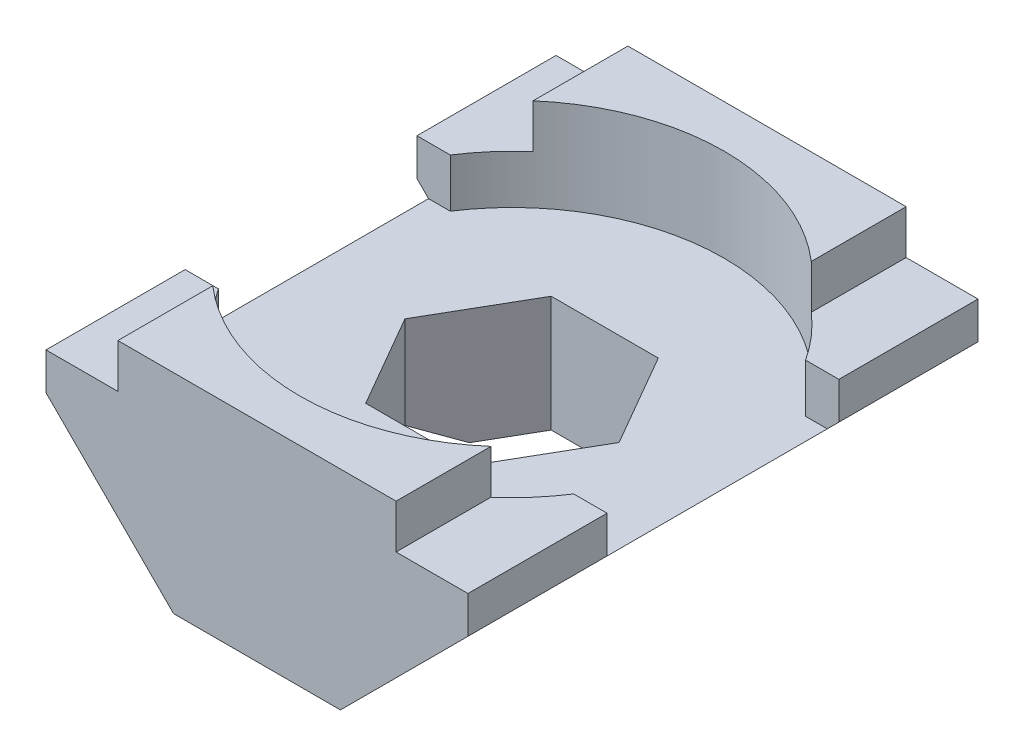
ISO-10303-21;
HEADER;
FILE_DESCRIPTION(('STEP AP214'),'2;1');
FILE_NAME('part.step','',(''),(''),'','','');
FILE_SCHEMA(('AUTOMOTIVE_DESIGN { 1 0 10303 214 1 1 1 1 }'));
ENDSEC;
DATA;
#1=APPLICATION_CONTEXT('core data for automotive mechanical design processes');
#2=APPLICATION_PROTOCOL_DEFINITION('international standard','automotive_design',2000,#1);
#3=PRODUCT_CONTEXT('',#1,'mechanical');
#4=PRODUCT('Part','Part','',(#3));
#5=PRODUCT_RELATED_PRODUCT_CATEGORY('part','',(#4));
#6=PRODUCT_DEFINITION_FORMATION('','',#4);
#7=PRODUCT_DEFINITION_CONTEXT('part definition',#1,'design');
#8=PRODUCT_DEFINITION('design','',#6,#7);
#9=PRODUCT_DEFINITION_SHAPE('','',#8);
#10=(LENGTH_UNIT() NAMED_UNIT(*) SI_UNIT(.MILLI.,.METRE.));
#11=(NAMED_UNIT(*) PLANE_ANGLE_UNIT() SI_UNIT($,.RADIAN.));
#12=(NAMED_UNIT(*) SI_UNIT($,.STERADIAN.) SOLID_ANGLE_UNIT());
#13=UNCERTAINTY_MEASURE_WITH_UNIT(LENGTH_MEASURE(1.E-05),#10,'distance_accuracy_value','');
#14=(GEOMETRIC_REPRESENTATION_CONTEXT(3) GLOBAL_UNCERTAINTY_ASSIGNED_CONTEXT((#13)) GLOBAL_UNIT_ASSIGNED_CONTEXT((#10,
#11,#12)) REPRESENTATION_CONTEXT('',''));
#15=CARTESIAN_POINT('',(0.,0.,0.));
#16=DIRECTION('',(0.,0.,1.));
#17=DIRECTION('',(1.,0.,0.));
#18=AXIS2_PLACEMENT_3D('',#15,#16,#17);
#19=CARTESIAN_POINT('',(-1.55,0.,16.));
#20=DIRECTION('',(0.,-1.,0.));
#21=DIRECTION('',(1.,0.,0.));
#22=AXIS2_PLACEMENT_3D('',#19,#20,#21);
#23=PLANE('',#22);
#24=DIRECTION('',(0.,0.,-1.));
#25=VECTOR('',#24,1.);
#26=CARTESIAN_POINT('',(-1.55,0.,16.));
#27=LINE('',#26,#25);
#28=CARTESIAN_POINT('',(-1.55,0.,13.5));
#29=VERTEX_POINT('',#28);
#30=CARTESIAN_POINT('',(-1.55,0.,10.5));
#31=VERTEX_POINT('',#30);
#32=EDGE_CURVE('E306',#29,#31,#27,.T.);
#33=ORIENTED_EDGE('',*,*,#32,.F.);
#34=DIRECTION('',(1.,0.,0.));
#35=VECTOR('',#34,1.);
#36=CARTESIAN_POINT('',(-1.55,0.,13.5));
#37=LINE('',#36,#35);
#38=CARTESIAN_POINT('',(0.,0.,13.5));
#39=VERTEX_POINT('',#38);
#40=EDGE_CURVE('E602',#29,#39,#37,.T.);
#41=ORIENTED_EDGE('',*,*,#40,.T.);
#42=DIRECTION('',(0.,0.,-1.));
#43=VECTOR('',#42,1.);
#44=CARTESIAN_POINT('',(0.,0.,16.));
#45=LINE('',#44,#43);
#46=CARTESIAN_POINT('',(0.,0.,11.4540736819008));
#47=VERTEX_POINT('',#46);
#48=EDGE_CURVE('E385',#39,#47,#45,.T.);
#49=ORIENTED_EDGE('',*,*,#48,.T.);
#50=CARTESIAN_POINT('',(3.,0.,8.));
#51=DIRECTION('',(0.,-1.,0.));
#52=DIRECTION('',(1.,0.,0.));
#53=AXIS2_PLACEMENT_3D('',#50,#51,#52);
#54=CIRCLE('',#53,4.575);
#55=CARTESIAN_POINT('',(-0.831530373101587,0.,10.5));
#56=VERTEX_POINT('',#55);
#57=EDGE_CURVE('E358',#47,#56,#54,.T.);
#58=ORIENTED_EDGE('',*,*,#57,.T.);
#59=DIRECTION('',(1.,0.,0.));
#60=VECTOR('',#59,1.);
#61=CARTESIAN_POINT('',(-1.55,0.,10.5));
#62=LINE('',#61,#60);
#63=EDGE_CURVE('E341',#31,#56,#62,.T.);
#64=ORIENTED_EDGE('',*,*,#63,.F.);
#65=EDGE_LOOP('',(#33,#41,#49,#58,#64));
#66=FACE_BOUND('',#65,.T.);
#67=ADVANCED_FACE('F39',(#66),#23,.F.);
#68=CARTESIAN_POINT('',(-1.55,-0.8,16.));
#69=DIRECTION('',(1.,0.,0.));
#70=DIRECTION('',(0.,0.,-1.));
#71=AXIS2_PLACEMENT_3D('',#68,#69,#70);
#72=PLANE('',#71);
#73=CARTESIAN_POINT('',(-1.55,0.,5.5));
#74=VERTEX_POINT('',#73);
#75=CARTESIAN_POINT('',(-1.55,0.,2.5));
#76=VERTEX_POINT('',#75);
#77=EDGE_CURVE('E305',#74,#76,#27,.T.);
#78=ORIENTED_EDGE('',*,*,#77,.T.);
#79=DIRECTION('',(0.,1.,0.));
#80=VECTOR('',#79,1.);
#81=CARTESIAN_POINT('',(-1.55,-3.55,2.5));
#82=LINE('',#81,#80);
#83=CARTESIAN_POINT('',(-1.55,-0.8,2.5));
#84=VERTEX_POINT('',#83);
#85=EDGE_CURVE('E603',#84,#76,#82,.T.);
#86=ORIENTED_EDGE('',*,*,#85,.F.);
#87=DIRECTION('',(0.,0.,-1.));
#88=VECTOR('',#87,1.);
#89=CARTESIAN_POINT('',(-1.55,-0.8,16.));
#90=LINE('',#89,#88);
#91=CARTESIAN_POINT('',(-1.55,-0.8,5.5));
#92=VERTEX_POINT('',#91);
#93=EDGE_CURVE('E301',#92,#84,#90,.T.);
#94=ORIENTED_EDGE('',*,*,#93,.F.);
#95=DIRECTION('',(0.,-1.,0.));
#96=VECTOR('',#95,1.);
#97=CARTESIAN_POINT('',(-1.55,0.95,5.5));
#98=LINE('',#97,#96);
#99=EDGE_CURVE('E428',#74,#92,#98,.T.);
#100=ORIENTED_EDGE('',*,*,#99,.F.);
#101=EDGE_LOOP('',(#78,#86,#94,#100));
#102=FACE_BOUND('',#101,.T.);
#103=ADVANCED_FACE('F684',(#102),#72,.F.);
#104=CARTESIAN_POINT('',(7.55,0.,16.));
#105=DIRECTION('',(-1.,0.,0.));
#106=DIRECTION('',(0.,0.,1.));
#107=AXIS2_PLACEMENT_3D('',#104,#105,#106);
#108=PLANE('',#107);
#109=DIRECTION('',(0.,0.,-1.));
#110=VECTOR('',#109,1.);
#111=CARTESIAN_POINT('',(7.55,0.,16.));
#112=LINE('',#111,#110);
#113=CARTESIAN_POINT('',(7.55,0.,13.5));
#114=VERTEX_POINT('',#113);
#115=CARTESIAN_POINT('',(7.55,0.,10.5));
#116=VERTEX_POINT('',#115);
#117=EDGE_CURVE('E286',#114,#116,#112,.T.);
#118=ORIENTED_EDGE('',*,*,#117,.F.);
#119=DIRECTION('',(0.,1.,0.));
#120=VECTOR('',#119,1.);
#121=CARTESIAN_POINT('',(7.55,-3.55,13.5));
#122=LINE('',#121,#120);
#123=CARTESIAN_POINT('',(7.55,-0.799999999999999,13.5));
#124=VERTEX_POINT('',#123);
#125=EDGE_CURVE('E615',#124,#114,#122,.T.);
#126=ORIENTED_EDGE('',*,*,#125,.F.);
#127=DIRECTION('',(0.,0.,-1.));
#128=VECTOR('',#127,1.);
#129=CARTESIAN_POINT('',(7.55,-0.799999999999999,16.));
#130=LINE('',#129,#128);
#131=CARTESIAN_POINT('',(7.55,-0.799999999999999,10.5));
#132=VERTEX_POINT('',#131);
#133=EDGE_CURVE('E290',#124,#132,#130,.T.);
#134=ORIENTED_EDGE('',*,*,#133,.T.);
#135=DIRECTION('',(0.,-1.,0.));
#136=VECTOR('',#135,1.);
#137=CARTESIAN_POINT('',(7.55,0.95,10.5));
#138=LINE('',#137,#136);
#139=EDGE_CURVE('E435',#116,#132,#138,.T.);
#140=ORIENTED_EDGE('',*,*,#139,.F.);
#141=EDGE_LOOP('',(#118,#126,#134,#140));
#142=FACE_BOUND('',#141,.T.);
#143=ADVANCED_FACE('F665',(#142),#108,.F.);
#144=CARTESIAN_POINT('',(6.,0.,16.));
#145=DIRECTION('',(0.,-1.,0.));
#146=DIRECTION('',(1.,0.,0.));
#147=AXIS2_PLACEMENT_3D('',#144,#145,#146);
#148=PLANE('',#147);
#149=DIRECTION('',(0.,0.,-1.));
#150=VECTOR('',#149,1.);
#151=CARTESIAN_POINT('',(6.,0.,16.));
#152=LINE('',#151,#150);
#153=CARTESIAN_POINT('',(6.,0.,13.5));
#154=VERTEX_POINT('',#153);
#155=CARTESIAN_POINT('',(6.,0.,11.4540736819008));
#156=VERTEX_POINT('',#155);
#157=EDGE_CURVE('E282',#154,#156,#152,.T.);
#158=ORIENTED_EDGE('',*,*,#157,.F.);
#159=DIRECTION('',(1.,0.,0.));
#160=VECTOR('',#159,1.);
#161=CARTESIAN_POINT('',(6.,0.,13.5));
#162=LINE('',#161,#160);
#163=EDGE_CURVE('E626',#154,#114,#162,.T.);
#164=ORIENTED_EDGE('',*,*,#163,.T.);
#165=ORIENTED_EDGE('',*,*,#117,.T.);
#166=DIRECTION('',(1.,0.,0.));
#167=VECTOR('',#166,1.);
#168=CARTESIAN_POINT('',(6.,0.,10.5));
#169=LINE('',#168,#167);
#170=CARTESIAN_POINT('',(6.83153037310159,0.,10.5));
#171=VERTEX_POINT('',#170);
#172=EDGE_CURVE('E456',#171,#116,#169,.T.);
#173=ORIENTED_EDGE('',*,*,#172,.F.);
#174=CARTESIAN_POINT('',(3.,0.,8.));
#175=DIRECTION('',(0.,-1.,0.));
#176=DIRECTION('',(1.,0.,0.));
#177=AXIS2_PLACEMENT_3D('',#174,#175,#176);
#178=CIRCLE('',#177,4.575);
#179=EDGE_CURVE('E378',#171,#156,#178,.T.);
#180=ORIENTED_EDGE('',*,*,#179,.T.);
#181=EDGE_LOOP('',(#158,#164,#165,#173,#180));
#182=FACE_BOUND('',#181,.T.);
#183=ADVANCED_FACE('F656',(#182),#148,.F.);
#184=CARTESIAN_POINT('',(0.,0.,4.54592631809916));
#185=VERTEX_POINT('',#184);
#186=CARTESIAN_POINT('',(0.,0.,2.5));
#187=VERTEX_POINT('',#186);
#188=EDGE_CURVE('E384',#185,#187,#45,.T.);
#189=ORIENTED_EDGE('',*,*,#188,.T.);
#190=DIRECTION('',(-1.,0.,0.));
#191=VECTOR('',#190,1.);
#192=CARTESIAN_POINT('',(-1.55,0.,2.5));
#193=LINE('',#192,#191);
#194=EDGE_CURVE('E398',#187,#76,#193,.T.);
#195=ORIENTED_EDGE('',*,*,#194,.T.);
#196=ORIENTED_EDGE('',*,*,#77,.F.);
#197=DIRECTION('',(-1.,0.,0.));
#198=VECTOR('',#197,1.);
#199=CARTESIAN_POINT('',(-1.55,0.,5.5));
#200=LINE('',#199,#198);
#201=CARTESIAN_POINT('',(-0.83153037310159,0.,5.5));
#202=VERTEX_POINT('',#201);
#203=EDGE_CURVE('E443',#202,#74,#200,.T.);
#204=ORIENTED_EDGE('',*,*,#203,.F.);
#205=EDGE_CURVE('E369',#202,#185,#54,.T.);
#206=ORIENTED_EDGE('',*,*,#205,.T.);
#207=EDGE_LOOP('',(#189,#195,#196,#204,#206));
#208=FACE_BOUND('',#207,.T.);
#209=ADVANCED_FACE('F396',(#208),#23,.F.);
#210=CARTESIAN_POINT('',(-1.55,-0.8,13.5));
#211=VERTEX_POINT('',#210);
#212=CARTESIAN_POINT('',(-1.55,-0.8,10.5));
#213=VERTEX_POINT('',#212);
#214=EDGE_CURVE('E302',#211,#213,#90,.T.);
#215=ORIENTED_EDGE('',*,*,#214,.F.);
#216=DIRECTION('',(0.,1.,0.));
#217=VECTOR('',#216,1.);
#218=CARTESIAN_POINT('',(-1.55,-3.55,13.5));
#219=LINE('',#218,#217);
#220=EDGE_CURVE('E255',#211,#29,#219,.T.);
#221=ORIENTED_EDGE('',*,*,#220,.T.);
#222=ORIENTED_EDGE('',*,*,#32,.T.);
#223=DIRECTION('',(0.,-1.,0.));
#224=VECTOR('',#223,1.);
#225=CARTESIAN_POINT('',(-1.55,0.95,10.5));
#226=LINE('',#225,#224);
#227=EDGE_CURVE('E439',#31,#213,#226,.T.);
#228=ORIENTED_EDGE('',*,*,#227,.T.);
#229=EDGE_LOOP('',(#215,#221,#222,#228));
#230=FACE_BOUND('',#229,.T.);
#231=ADVANCED_FACE('F639',(#230),#72,.F.);
#232=CARTESIAN_POINT('',(1.20000000000001,-3.55,16.));
#233=DIRECTION('',(0.707106781186546,0.707106781186549,0.));
#234=DIRECTION('',(-0.707106781186549,0.707106781186546,0.));
#235=AXIS2_PLACEMENT_3D('',#232,#233,#234);
#236=PLANE('',#235);
#237=ORIENTED_EDGE('',*,*,#93,.T.);
#238=DIRECTION('',(0.707106781186549,-0.707106781186546,0.));
#239=VECTOR('',#238,1.);
#240=CARTESIAN_POINT('',(1.20000000000001,-3.55,2.5));
#241=LINE('',#240,#239);
#242=CARTESIAN_POINT('',(1.20000000000001,-3.55,2.5));
#243=VERTEX_POINT('',#242);
#244=EDGE_CURVE('E416',#84,#243,#241,.T.);
#245=ORIENTED_EDGE('',*,*,#244,.T.);
#246=DIRECTION('',(0.,0.,-1.));
#247=VECTOR('',#246,1.);
#248=CARTESIAN_POINT('',(1.20000000000001,-3.55,16.));
#249=LINE('',#248,#247);
#250=CARTESIAN_POINT('',(1.20000000000001,-3.55,7.11769145362396));
#251=VERTEX_POINT('',#250);
#252=EDGE_CURVE('E297',#251,#243,#249,.T.);
#253=ORIENTED_EDGE('',*,*,#252,.F.);
#254=DIRECTION('',(-0.447213595499958,0.447213595499956,0.774596669241484));
#255=VECTOR('',#254,1.);
#256=CARTESIAN_POINT('',(-1.87692193816531,-0.473078061834696,12.4470765814496));
#257=LINE('',#256,#255);
#258=CARTESIAN_POINT('',(0.690598923241496,-3.04059892324149,8.));
#259=VERTEX_POINT('',#258);
#260=EDGE_CURVE('E539',#251,#259,#257,.T.);
#261=ORIENTED_EDGE('',*,*,#260,.T.);
#262=DIRECTION('',(0.447213595499959,-0.447213595499957,0.774596669241484));
#263=VECTOR('',#262,1.);
#264=CARTESIAN_POINT('',(3.66564064605511,-6.01564064605509,13.1529234185504));
#265=LINE('',#264,#263);
#266=CARTESIAN_POINT('',(1.20000000000001,-3.55,8.88230854637604));
#267=VERTEX_POINT('',#266);
#268=EDGE_CURVE('E542',#259,#267,#265,.T.);
#269=ORIENTED_EDGE('',*,*,#268,.T.);
#270=CARTESIAN_POINT('',(1.20000000000001,-3.55,13.5));
#271=VERTEX_POINT('',#270);
#272=EDGE_CURVE('E298',#271,#267,#249,.T.);
#273=ORIENTED_EDGE('',*,*,#272,.F.);
#274=DIRECTION('',(-0.707106781186549,0.707106781186546,0.));
#275=VECTOR('',#274,1.);
#276=CARTESIAN_POINT('',(1.20000000000001,-3.55,13.5));
#277=LINE('',#276,#275);
#278=EDGE_CURVE('E267',#271,#211,#277,.T.);
#279=ORIENTED_EDGE('',*,*,#278,.T.);
#280=ORIENTED_EDGE('',*,*,#214,.T.);
#281=DIRECTION('',(-0.707106781186549,0.707106781186546,0.));
#282=VECTOR('',#281,1.);
#283=CARTESIAN_POINT('',(1.20000000000001,-3.55,10.5));
#284=LINE('',#283,#282);
#285=CARTESIAN_POINT('',(-1.3,-1.05,10.5));
#286=VERTEX_POINT('',#285);
#287=EDGE_CURVE('E466',#286,#213,#284,.T.);
#288=ORIENTED_EDGE('',*,*,#287,.F.);
#289=DIRECTION('',(0.,0.,1.));
#290=VECTOR('',#289,1.);
#291=CARTESIAN_POINT('',(-1.3,-1.05,16.));
#292=LINE('',#291,#290);
#293=CARTESIAN_POINT('',(-1.3,-1.05,5.5));
#294=VERTEX_POINT('',#293);
#295=EDGE_CURVE('E382',#294,#286,#292,.T.);
#296=ORIENTED_EDGE('',*,*,#295,.F.);
#297=DIRECTION('',(0.707106781186549,-0.707106781186546,0.));
#298=VECTOR('',#297,1.);
#299=CARTESIAN_POINT('',(1.20000000000001,-3.55,5.5));
#300=LINE('',#299,#298);
#301=EDGE_CURVE('E452',#92,#294,#300,.T.);
#302=ORIENTED_EDGE('',*,*,#301,.F.);
#303=EDGE_LOOP('',(#237,#245,#253,#261,#269,#273,#279,#280,#288,#296,#302));
#304=FACE_BOUND('',#303,.T.);
#305=ADVANCED_FACE('F637',(#304),#236,.F.);
#306=CARTESIAN_POINT('',(7.55,-0.799999999999999,16.));
#307=DIRECTION('',(-0.707106781186546,0.707106781186549,0.));
#308=DIRECTION('',(-0.707106781186549,-0.707106781186546,0.));
#309=AXIS2_PLACEMENT_3D('',#306,#307,#308);
#310=PLANE('',#309);
#311=DIRECTION('',(0.,0.,-1.));
#312=VECTOR('',#311,1.);
#313=CARTESIAN_POINT('',(4.79999999999999,-3.55,16.));
#314=LINE('',#313,#312);
#315=CARTESIAN_POINT('',(4.79999999999999,-3.55,7.11769145362396));
#316=VERTEX_POINT('',#315);
#317=CARTESIAN_POINT('',(4.79999999999999,-3.55,2.5));
#318=VERTEX_POINT('',#317);
#319=EDGE_CURVE('E293',#316,#318,#314,.T.);
#320=ORIENTED_EDGE('',*,*,#319,.T.);
#321=DIRECTION('',(0.707106781186549,0.707106781186546,0.));
#322=VECTOR('',#321,1.);
#323=CARTESIAN_POINT('',(7.55,-0.799999999999999,2.5));
#324=LINE('',#323,#322);
#325=CARTESIAN_POINT('',(7.55,-0.799999999999999,2.5));
#326=VERTEX_POINT('',#325);
#327=EDGE_CURVE('E409',#318,#326,#324,.T.);
#328=ORIENTED_EDGE('',*,*,#327,.T.);
#329=CARTESIAN_POINT('',(7.55,-0.799999999999999,5.5));
#330=VERTEX_POINT('',#329);
#331=EDGE_CURVE('E289',#330,#326,#130,.T.);
#332=ORIENTED_EDGE('',*,*,#331,.F.);
#333=DIRECTION('',(0.707106781186549,0.707106781186546,0.));
#334=VECTOR('',#333,1.);
#335=CARTESIAN_POINT('',(7.55,-0.799999999999999,5.5));
#336=LINE('',#335,#334);
#337=CARTESIAN_POINT('',(7.3,-1.05,5.5));
#338=VERTEX_POINT('',#337);
#339=EDGE_CURVE('E449',#338,#330,#336,.T.);
#340=ORIENTED_EDGE('',*,*,#339,.F.);
#341=DIRECTION('',(0.,0.,-1.));
#342=VECTOR('',#341,1.);
#343=CARTESIAN_POINT('',(7.3,-1.05,16.));
#344=LINE('',#343,#342);
#345=CARTESIAN_POINT('',(7.3,-1.05,10.5));
#346=VERTEX_POINT('',#345);
#347=EDGE_CURVE('E317',#346,#338,#344,.T.);
#348=ORIENTED_EDGE('',*,*,#347,.F.);
#349=DIRECTION('',(-0.707106781186549,-0.707106781186546,0.));
#350=VECTOR('',#349,1.);
#351=CARTESIAN_POINT('',(7.55,-0.799999999999999,10.5));
#352=LINE('',#351,#350);
#353=EDGE_CURVE('E462',#132,#346,#352,.T.);
#354=ORIENTED_EDGE('',*,*,#353,.F.);
#355=ORIENTED_EDGE('',*,*,#133,.F.);
#356=DIRECTION('',(-0.707106781186549,-0.707106781186546,0.));
#357=VECTOR('',#356,1.);
#358=CARTESIAN_POINT('',(7.55,-0.799999999999999,13.5));
#359=LINE('',#358,#357);
#360=CARTESIAN_POINT('',(4.79999999999999,-3.55,13.5));
#361=VERTEX_POINT('',#360);
#362=EDGE_CURVE('E630',#124,#361,#359,.T.);
#363=ORIENTED_EDGE('',*,*,#362,.T.);
#364=CARTESIAN_POINT('',(4.79999999999999,-3.55,8.88230854637604));
#365=VERTEX_POINT('',#364);
#366=EDGE_CURVE('E294',#361,#365,#314,.T.);
#367=ORIENTED_EDGE('',*,*,#366,.T.);
#368=DIRECTION('',(0.447213595499958,0.447213595499957,-0.774596669241484));
#369=VECTOR('',#368,1.);
#370=CARTESIAN_POINT('',(3.43435935394489,-4.91564064605509,11.2476675302247));
#371=LINE('',#370,#369);
#372=CARTESIAN_POINT('',(5.3094010767585,-3.04059892324149,8.));
#373=VERTEX_POINT('',#372);
#374=EDGE_CURVE('E362',#365,#373,#371,.T.);
#375=ORIENTED_EDGE('',*,*,#374,.T.);
#376=DIRECTION('',(-0.447213595499958,-0.447213595499957,-0.774596669241484));
#377=VECTOR('',#376,1.);
#378=CARTESIAN_POINT('',(8.97692193816531,0.626921938165306,14.3523324697754));
#379=LINE('',#378,#377);
#380=EDGE_CURVE('E520',#373,#316,#379,.T.);
#381=ORIENTED_EDGE('',*,*,#380,.T.);
#382=EDGE_LOOP('',(#320,#328,#332,#340,#348,#354,#355,#363,#367,#375,#381));
#383=FACE_BOUND('',#382,.T.);
#384=ADVANCED_FACE('F552',(#383),#310,.F.);
#385=ORIENTED_EDGE('',*,*,#331,.T.);
#386=DIRECTION('',(0.,1.,0.));
#387=VECTOR('',#386,1.);
#388=CARTESIAN_POINT('',(7.55,-3.55,2.5));
#389=LINE('',#388,#387);
#390=CARTESIAN_POINT('',(7.55,0.,2.5));
#391=VERTEX_POINT('',#390);
#392=EDGE_CURVE('E600',#326,#391,#389,.T.);
#393=ORIENTED_EDGE('',*,*,#392,.T.);
#394=CARTESIAN_POINT('',(7.55,0.,5.5));
#395=VERTEX_POINT('',#394);
#396=EDGE_CURVE('E285',#395,#391,#112,.T.);
#397=ORIENTED_EDGE('',*,*,#396,.F.);
#398=DIRECTION('',(0.,-1.,0.));
#399=VECTOR('',#398,1.);
#400=CARTESIAN_POINT('',(7.55,0.95,5.5));
#401=LINE('',#400,#399);
#402=EDGE_CURVE('E431',#395,#330,#401,.T.);
#403=ORIENTED_EDGE('',*,*,#402,.T.);
#404=EDGE_LOOP('',(#385,#393,#397,#403));
#405=FACE_BOUND('',#404,.T.);
#406=ADVANCED_FACE('F598',(#405),#108,.F.);
#407=ORIENTED_EDGE('',*,*,#396,.T.);
#408=DIRECTION('',(-1.,0.,0.));
#409=VECTOR('',#408,1.);
#410=CARTESIAN_POINT('',(6.,0.,2.5));
#411=LINE('',#410,#409);
#412=CARTESIAN_POINT('',(6.,0.,2.5));
#413=VERTEX_POINT('',#412);
#414=EDGE_CURVE('E266',#391,#413,#411,.T.);
#415=ORIENTED_EDGE('',*,*,#414,.T.);
#416=CARTESIAN_POINT('',(6.,0.,4.54592631809916));
#417=VERTEX_POINT('',#416);
#418=EDGE_CURVE('E264',#417,#413,#152,.T.);
#419=ORIENTED_EDGE('',*,*,#418,.F.);
#420=CARTESIAN_POINT('',(6.83153037310159,0.,5.5));
#421=VERTEX_POINT('',#420);
#422=EDGE_CURVE('E373',#417,#421,#178,.T.);
#423=ORIENTED_EDGE('',*,*,#422,.T.);
#424=DIRECTION('',(-1.,0.,0.));
#425=VECTOR('',#424,1.);
#426=CARTESIAN_POINT('',(6.,0.,5.5));
#427=LINE('',#426,#425);
#428=EDGE_CURVE('E446',#395,#421,#427,.T.);
#429=ORIENTED_EDGE('',*,*,#428,.F.);
#430=EDGE_LOOP('',(#407,#415,#419,#423,#429));
#431=FACE_BOUND('',#430,.T.);
#432=ADVANCED_FACE('F595',(#431),#148,.F.);
#433=CARTESIAN_POINT('',(3.,-1.05,8.));
#434=DIRECTION('',(0.,1.,0.));
#435=DIRECTION('',(0.,0.,1.));
#436=AXIS2_PLACEMENT_3D('',#433,#434,#435);
#437=CYLINDRICAL_SURFACE('',#436,4.575);
#438=DIRECTION('',(0.,1.,0.));
#439=VECTOR('',#438,1.);
#440=CARTESIAN_POINT('',(-0.831530373101587,-1.05,10.5));
#441=LINE('',#440,#439);
#442=CARTESIAN_POINT('',(-0.831530373101587,-1.05,10.5));
#443=VERTEX_POINT('',#442);
#444=EDGE_CURVE('E47',#56,#443,#441,.F.);
#445=ORIENTED_EDGE('',*,*,#444,.F.);
#446=ORIENTED_EDGE('',*,*,#57,.F.);
#447=DIRECTION('',(0.,1.,0.));
#448=VECTOR('',#447,1.);
#449=CARTESIAN_POINT('',(0.,-1.05,11.4540736819008));
#450=LINE('',#449,#448);
#451=CARTESIAN_POINT('',(0.,0.95,11.4540736819008));
#452=VERTEX_POINT('',#451);
#453=EDGE_CURVE('E309',#452,#47,#450,.F.);
#454=ORIENTED_EDGE('',*,*,#453,.F.);
#455=CARTESIAN_POINT('',(3.,0.95,8.));
#456=DIRECTION('',(0.,1.,0.));
#457=DIRECTION('',(0.,0.,1.));
#458=AXIS2_PLACEMENT_3D('',#455,#456,#457);
#459=CIRCLE('',#458,4.575);
#460=CARTESIAN_POINT('',(6.,0.95,11.4540736819008));
#461=VERTEX_POINT('',#460);
#462=EDGE_CURVE('E359',#452,#461,#459,.T.);
#463=ORIENTED_EDGE('',*,*,#462,.T.);
#464=DIRECTION('',(0.,1.,0.));
#465=VECTOR('',#464,1.);
#466=CARTESIAN_POINT('',(6.,-1.05,11.4540736819008));
#467=LINE('',#466,#465);
#468=EDGE_CURVE('E377',#156,#461,#467,.T.);
#469=ORIENTED_EDGE('',*,*,#468,.F.);
#470=ORIENTED_EDGE('',*,*,#179,.F.);
#471=DIRECTION('',(0.,1.,0.));
#472=VECTOR('',#471,1.);
#473=CARTESIAN_POINT('',(6.83153037310159,-1.05,10.5));
#474=LINE('',#473,#472);
#475=CARTESIAN_POINT('',(6.83153037310159,-1.05,10.5));
#476=VERTEX_POINT('',#475);
#477=EDGE_CURVE('E327',#476,#171,#474,.T.);
#478=ORIENTED_EDGE('',*,*,#477,.F.);
#479=CARTESIAN_POINT('',(3.,-1.05,8.));
#480=DIRECTION('',(0.,1.,0.));
#481=DIRECTION('',(0.,0.,1.));
#482=AXIS2_PLACEMENT_3D('',#479,#480,#481);
#483=CIRCLE('',#482,4.575);
#484=EDGE_CURVE('E347',#443,#476,#483,.T.);
#485=ORIENTED_EDGE('',*,*,#484,.F.);
#486=EDGE_LOOP('',(#445,#446,#454,#463,#469,#470,#478,#485));
#487=FACE_BOUND('',#486,.T.);
#488=ADVANCED_FACE('F348',(#487),#437,.F.);
#489=DIRECTION('',(0.,1.,0.));
#490=VECTOR('',#489,1.);
#491=CARTESIAN_POINT('',(6.83153037310159,-1.05,5.5));
#492=LINE('',#491,#490);
#493=CARTESIAN_POINT('',(6.83153037310159,-1.05,5.5));
#494=VERTEX_POINT('',#493);
#495=EDGE_CURVE('E323',#421,#494,#492,.F.);
#496=ORIENTED_EDGE('',*,*,#495,.F.);
#497=ORIENTED_EDGE('',*,*,#422,.F.);
#498=DIRECTION('',(0.,1.,0.));
#499=VECTOR('',#498,1.);
#500=CARTESIAN_POINT('',(6.,-1.05,4.54592631809916));
#501=LINE('',#500,#499);
#502=CARTESIAN_POINT('',(6.,0.95,4.54592631809916));
#503=VERTEX_POINT('',#502);
#504=EDGE_CURVE('E370',#503,#417,#501,.F.);
#505=ORIENTED_EDGE('',*,*,#504,.F.);
#506=CARTESIAN_POINT('',(0.,0.95,4.54592631809916));
#507=VERTEX_POINT('',#506);
#508=EDGE_CURVE('E271',#503,#507,#459,.T.);
#509=ORIENTED_EDGE('',*,*,#508,.T.);
#510=DIRECTION('',(0.,1.,0.));
#511=VECTOR('',#510,1.);
#512=CARTESIAN_POINT('',(0.,-1.05,4.54592631809916));
#513=LINE('',#512,#511);
#514=EDGE_CURVE('E313',#185,#507,#513,.T.);
#515=ORIENTED_EDGE('',*,*,#514,.F.);
#516=ORIENTED_EDGE('',*,*,#205,.F.);
#517=DIRECTION('',(0.,1.,0.));
#518=VECTOR('',#517,1.);
#519=CARTESIAN_POINT('',(-0.83153037310159,-1.05,5.5));
#520=LINE('',#519,#518);
#521=CARTESIAN_POINT('',(-0.83153037310159,-1.05,5.5));
#522=VERTEX_POINT('',#521);
#523=EDGE_CURVE('E320',#522,#202,#520,.T.);
#524=ORIENTED_EDGE('',*,*,#523,.F.);
#525=EDGE_CURVE('E353',#494,#522,#483,.T.);
#526=ORIENTED_EDGE('',*,*,#525,.F.);
#527=EDGE_LOOP('',(#496,#497,#505,#509,#515,#516,#524,#526));
#528=FACE_BOUND('',#527,.T.);
#529=ADVANCED_FACE('F688',(#528),#437,.F.);
#530=CARTESIAN_POINT('',(4.79999999999999,-3.55,16.));
#531=DIRECTION('',(0.,1.,0.));
#532=DIRECTION('',(0.,0.,1.));
#533=AXIS2_PLACEMENT_3D('',#530,#531,#532);
#534=PLANE('',#533);
#535=ORIENTED_EDGE('',*,*,#366,.F.);
#536=DIRECTION('',(-1.,0.,0.));
#537=VECTOR('',#536,1.);
#538=CARTESIAN_POINT('',(-1.55,-3.55,13.5));
#539=LINE('',#538,#537);
#540=EDGE_CURVE('E612',#361,#271,#539,.T.);
#541=ORIENTED_EDGE('',*,*,#540,.T.);
#542=ORIENTED_EDGE('',*,*,#272,.T.);
#543=DIRECTION('',(0.5,0.,0.866025403784439));
#544=VECTOR('',#543,1.);
#545=CARTESIAN_POINT('',(0.690598923241497,-3.55,8.));
#546=LINE('',#545,#544);
#547=CARTESIAN_POINT('',(1.84529946162075,-3.55,10.));
#548=VERTEX_POINT('',#547);
#549=EDGE_CURVE('E487',#267,#548,#546,.T.);
#550=ORIENTED_EDGE('',*,*,#549,.T.);
#551=DIRECTION('',(1.,0.,0.));
#552=VECTOR('',#551,1.);
#553=CARTESIAN_POINT('',(1.84529946162075,-3.55,10.));
#554=LINE('',#553,#552);
#555=CARTESIAN_POINT('',(4.15470053837925,-3.55,10.));
#556=VERTEX_POINT('',#555);
#557=EDGE_CURVE('E491',#548,#556,#554,.T.);
#558=ORIENTED_EDGE('',*,*,#557,.T.);
#559=DIRECTION('',(0.5,0.,-0.866025403784439));
#560=VECTOR('',#559,1.);
#561=CARTESIAN_POINT('',(4.15470053837925,-3.55,10.));
#562=LINE('',#561,#560);
#563=EDGE_CURVE('E470',#556,#365,#562,.T.);
#564=ORIENTED_EDGE('',*,*,#563,.T.);
#565=EDGE_LOOP('',(#535,#541,#542,#550,#558,#564));
#566=FACE_BOUND('',#565,.T.);
#567=ADVANCED_FACE('F561',(#566),#534,.F.);
#568=CARTESIAN_POINT('',(6.,0.95,16.));
#569=DIRECTION('',(-1.,0.,0.));
#570=DIRECTION('',(0.,0.,1.));
#571=AXIS2_PLACEMENT_3D('',#568,#569,#570);
#572=PLANE('',#571);
#573=DIRECTION('',(0.,0.,-1.));
#574=VECTOR('',#573,1.);
#575=CARTESIAN_POINT('',(6.,0.95,16.));
#576=LINE('',#575,#574);
#577=CARTESIAN_POINT('',(6.,0.95,13.5));
#578=VERTEX_POINT('',#577);
#579=EDGE_CURVE('E273',#578,#461,#576,.T.);
#580=ORIENTED_EDGE('',*,*,#579,.F.);
#581=DIRECTION('',(0.,-1.,0.));
#582=VECTOR('',#581,1.);
#583=CARTESIAN_POINT('',(6.,0.95,13.5));
#584=LINE('',#583,#582);
#585=EDGE_CURVE('E607',#578,#154,#584,.T.);
#586=ORIENTED_EDGE('',*,*,#585,.T.);
#587=ORIENTED_EDGE('',*,*,#157,.T.);
#588=ORIENTED_EDGE('',*,*,#468,.T.);
#589=EDGE_LOOP('',(#580,#586,#587,#588));
#590=FACE_BOUND('',#589,.T.);
#591=ADVANCED_FACE('F651',(#590),#572,.F.);
#592=CARTESIAN_POINT('',(0.,0.95,16.));
#593=DIRECTION('',(0.,-1.,0.));
#594=DIRECTION('',(0.,0.,-1.));
#595=AXIS2_PLACEMENT_3D('',#592,#593,#594);
#596=PLANE('',#595);
#597=DIRECTION('',(0.,0.,-1.));
#598=VECTOR('',#597,1.);
#599=CARTESIAN_POINT('',(0.,0.95,16.));
#600=LINE('',#599,#598);
#601=CARTESIAN_POINT('',(0.,0.95,13.5));
#602=VERTEX_POINT('',#601);
#603=EDGE_CURVE('E274',#602,#452,#600,.T.);
#604=ORIENTED_EDGE('',*,*,#603,.F.);
#605=DIRECTION('',(-1.,0.,0.));
#606=VECTOR('',#605,1.);
#607=CARTESIAN_POINT('',(-1.55,0.95,13.5));
#608=LINE('',#607,#606);
#609=EDGE_CURVE('E62',#578,#602,#608,.T.);
#610=ORIENTED_EDGE('',*,*,#609,.F.);
#611=ORIENTED_EDGE('',*,*,#579,.T.);
#612=ORIENTED_EDGE('',*,*,#462,.F.);
#613=EDGE_LOOP('',(#604,#610,#611,#612));
#614=FACE_BOUND('',#613,.T.);
#615=ADVANCED_FACE('F647',(#614),#596,.F.);
#616=CARTESIAN_POINT('',(0.,0.,16.));
#617=DIRECTION('',(1.,0.,0.));
#618=DIRECTION('',(0.,0.,-1.));
#619=AXIS2_PLACEMENT_3D('',#616,#617,#618);
#620=PLANE('',#619);
#621=CARTESIAN_POINT('',(0.,0.95,2.5));
#622=VERTEX_POINT('',#621);
#623=EDGE_CURVE('E278',#507,#622,#600,.T.);
#624=ORIENTED_EDGE('',*,*,#623,.T.);
#625=DIRECTION('',(0.,-1.,0.));
#626=VECTOR('',#625,1.);
#627=CARTESIAN_POINT('',(0.,0.,2.5));
#628=LINE('',#627,#626);
#629=EDGE_CURVE('E54',#622,#187,#628,.T.);
#630=ORIENTED_EDGE('',*,*,#629,.T.);
#631=ORIENTED_EDGE('',*,*,#188,.F.);
#632=ORIENTED_EDGE('',*,*,#514,.T.);
#633=EDGE_LOOP('',(#624,#630,#631,#632));
#634=FACE_BOUND('',#633,.T.);
#635=ADVANCED_FACE('F404',(#634),#620,.F.);
#636=ORIENTED_EDGE('',*,*,#252,.T.);
#637=DIRECTION('',(1.,0.,0.));
#638=VECTOR('',#637,1.);
#639=CARTESIAN_POINT('',(-1.55,-3.55,2.5));
#640=LINE('',#639,#638);
#641=EDGE_CURVE('E254',#243,#318,#640,.T.);
#642=ORIENTED_EDGE('',*,*,#641,.T.);
#643=ORIENTED_EDGE('',*,*,#319,.F.);
#644=DIRECTION('',(-0.5,0.,-0.866025403784438));
#645=VECTOR('',#644,1.);
#646=CARTESIAN_POINT('',(5.3094010767585,-3.55,8.));
#647=LINE('',#646,#645);
#648=CARTESIAN_POINT('',(4.15470053837925,-3.55,6.));
#649=VERTEX_POINT('',#648);
#650=EDGE_CURVE('E474',#316,#649,#647,.T.);
#651=ORIENTED_EDGE('',*,*,#650,.T.);
#652=DIRECTION('',(-1.,0.,0.));
#653=VECTOR('',#652,1.);
#654=CARTESIAN_POINT('',(4.15470053837925,-3.55,6.));
#655=LINE('',#654,#653);
#656=CARTESIAN_POINT('',(1.84529946162075,-3.55,6.));
#657=VERTEX_POINT('',#656);
#658=EDGE_CURVE('E479',#649,#657,#655,.T.);
#659=ORIENTED_EDGE('',*,*,#658,.T.);
#660=DIRECTION('',(-0.5,0.,0.866025403784439));
#661=VECTOR('',#660,1.);
#662=CARTESIAN_POINT('',(1.84529946162075,-3.55,6.));
#663=LINE('',#662,#661);
#664=EDGE_CURVE('E483',#657,#251,#663,.T.);
#665=ORIENTED_EDGE('',*,*,#664,.T.);
#666=EDGE_LOOP('',(#636,#642,#643,#651,#659,#665));
#667=FACE_BOUND('',#666,.T.);
#668=ADVANCED_FACE('F583',(#667),#534,.F.);
#669=ORIENTED_EDGE('',*,*,#418,.T.);
#670=DIRECTION('',(0.,1.,0.));
#671=VECTOR('',#670,1.);
#672=CARTESIAN_POINT('',(6.,0.95,2.5));
#673=LINE('',#672,#671);
#674=CARTESIAN_POINT('',(6.,0.95,2.5));
#675=VERTEX_POINT('',#674);
#676=EDGE_CURVE('E247',#413,#675,#673,.T.);
#677=ORIENTED_EDGE('',*,*,#676,.T.);
#678=EDGE_CURVE('E262',#503,#675,#576,.T.);
#679=ORIENTED_EDGE('',*,*,#678,.F.);
#680=ORIENTED_EDGE('',*,*,#504,.T.);
#681=EDGE_LOOP('',(#669,#677,#679,#680));
#682=FACE_BOUND('',#681,.T.);
#683=ADVANCED_FACE('F260',(#682),#572,.F.);
#684=ORIENTED_EDGE('',*,*,#678,.T.);
#685=DIRECTION('',(1.,0.,0.));
#686=VECTOR('',#685,1.);
#687=CARTESIAN_POINT('',(-1.55,0.95,2.5));
#688=LINE('',#687,#686);
#689=EDGE_CURVE('E244',#622,#675,#688,.T.);
#690=ORIENTED_EDGE('',*,*,#689,.F.);
#691=ORIENTED_EDGE('',*,*,#623,.F.);
#692=ORIENTED_EDGE('',*,*,#508,.F.);
#693=EDGE_LOOP('',(#684,#690,#691,#692));
#694=FACE_BOUND('',#693,.T.);
#695=ADVANCED_FACE('F270',(#694),#596,.F.);
#696=ORIENTED_EDGE('',*,*,#48,.F.);
#697=DIRECTION('',(0.,1.,0.));
#698=VECTOR('',#697,1.);
#699=CARTESIAN_POINT('',(0.,0.,13.5));
#700=LINE('',#699,#698);
#701=EDGE_CURVE('E11',#39,#602,#700,.T.);
#702=ORIENTED_EDGE('',*,*,#701,.T.);
#703=ORIENTED_EDGE('',*,*,#603,.T.);
#704=ORIENTED_EDGE('',*,*,#453,.T.);
#705=EDGE_LOOP('',(#696,#702,#703,#704));
#706=FACE_BOUND('',#705,.T.);
#707=ADVANCED_FACE('F644',(#706),#620,.F.);
#708=CARTESIAN_POINT('',(3.,-1.05,8.));
#709=DIRECTION('',(0.,1.,0.));
#710=DIRECTION('',(0.,0.,1.));
#711=AXIS2_PLACEMENT_3D('',#708,#709,#710);
#712=PLANE('',#711);
#713=DIRECTION('',(1.,0.,0.));
#714=VECTOR('',#713,1.);
#715=CARTESIAN_POINT('',(-1.55,-1.05,10.5));
#716=LINE('',#715,#714);
#717=EDGE_CURVE('E337',#286,#443,#716,.T.);
#718=ORIENTED_EDGE('',*,*,#717,.T.);
#719=ORIENTED_EDGE('',*,*,#484,.T.);
#720=EDGE_CURVE('E420',#476,#346,#716,.T.);
#721=ORIENTED_EDGE('',*,*,#720,.T.);
#722=ORIENTED_EDGE('',*,*,#347,.T.);
#723=DIRECTION('',(-1.,0.,0.));
#724=VECTOR('',#723,1.);
#725=CARTESIAN_POINT('',(-1.55,-1.05,5.5));
#726=LINE('',#725,#724);
#727=EDGE_CURVE('E427',#338,#494,#726,.T.);
#728=ORIENTED_EDGE('',*,*,#727,.T.);
#729=ORIENTED_EDGE('',*,*,#525,.T.);
#730=EDGE_CURVE('E423',#522,#294,#726,.T.);
#731=ORIENTED_EDGE('',*,*,#730,.T.);
#732=ORIENTED_EDGE('',*,*,#295,.T.);
#733=EDGE_LOOP('',(#718,#719,#721,#722,#728,#729,#731,#732));
#734=FACE_BOUND('',#733,.T.);
#735=DIRECTION('',(0.5,0.,-0.866025403784439));
#736=VECTOR('',#735,1.);
#737=CARTESIAN_POINT('',(4.15470053837925,-1.05,10.));
#738=LINE('',#737,#736);
#739=CARTESIAN_POINT('',(4.15470053837925,-1.05,10.));
#740=VERTEX_POINT('',#739);
#741=CARTESIAN_POINT('',(5.3094010767585,-1.05,8.));
#742=VERTEX_POINT('',#741);
#743=EDGE_CURVE('E469',#740,#742,#738,.T.);
#744=ORIENTED_EDGE('',*,*,#743,.F.);
#745=DIRECTION('',(1.,0.,0.));
#746=VECTOR('',#745,1.);
#747=CARTESIAN_POINT('',(1.84529946162075,-1.05,10.));
#748=LINE('',#747,#746);
#749=CARTESIAN_POINT('',(1.84529946162075,-1.05,10.));
#750=VERTEX_POINT('',#749);
#751=EDGE_CURVE('E475',#750,#740,#748,.T.);
#752=ORIENTED_EDGE('',*,*,#751,.F.);
#753=DIRECTION('',(0.5,0.,0.866025403784439));
#754=VECTOR('',#753,1.);
#755=CARTESIAN_POINT('',(0.690598923241497,-1.05,8.));
#756=LINE('',#755,#754);
#757=CARTESIAN_POINT('',(0.690598923241497,-1.05,8.));
#758=VERTEX_POINT('',#757);
#759=EDGE_CURVE('E510',#758,#750,#756,.T.);
#760=ORIENTED_EDGE('',*,*,#759,.F.);
#761=DIRECTION('',(-0.5,0.,0.866025403784439));
#762=VECTOR('',#761,1.);
#763=CARTESIAN_POINT('',(1.84529946162075,-1.05,6.));
#764=LINE('',#763,#762);
#765=CARTESIAN_POINT('',(1.84529946162075,-1.05,6.));
#766=VERTEX_POINT('',#765);
#767=EDGE_CURVE('E506',#766,#758,#764,.T.);
#768=ORIENTED_EDGE('',*,*,#767,.F.);
#769=DIRECTION('',(-1.,0.,0.));
#770=VECTOR('',#769,1.);
#771=CARTESIAN_POINT('',(4.15470053837925,-1.05,6.));
#772=LINE('',#771,#770);
#773=CARTESIAN_POINT('',(4.15470053837925,-1.05,6.));
#774=VERTEX_POINT('',#773);
#775=EDGE_CURVE('E502',#774,#766,#772,.T.);
#776=ORIENTED_EDGE('',*,*,#775,.F.);
#777=DIRECTION('',(-0.5,0.,-0.866025403784438));
#778=VECTOR('',#777,1.);
#779=CARTESIAN_POINT('',(5.3094010767585,-1.05,8.));
#780=LINE('',#779,#778);
#781=EDGE_CURVE('E498',#742,#774,#780,.T.);
#782=ORIENTED_EDGE('',*,*,#781,.F.);
#783=EDGE_LOOP('',(#744,#752,#760,#768,#776,#782));
#784=FACE_BOUND('',#783,.T.);
#785=ADVANCED_FACE('F574',(#734,#784),#712,.T.);
#786=CARTESIAN_POINT('',(4.15470053837925,-3.55,10.));
#787=DIRECTION('',(0.866025403784439,0.,0.5));
#788=DIRECTION('',(0.5,0.,-0.866025403784439));
#789=AXIS2_PLACEMENT_3D('',#786,#787,#788);
#790=PLANE('',#789);
#791=ORIENTED_EDGE('',*,*,#563,.F.);
#792=DIRECTION('',(0.,1.,0.));
#793=VECTOR('',#792,1.);
#794=CARTESIAN_POINT('',(4.15470053837925,-3.55,10.));
#795=LINE('',#794,#793);
#796=EDGE_CURVE('E517',#556,#740,#795,.T.);
#797=ORIENTED_EDGE('',*,*,#796,.T.);
#798=ORIENTED_EDGE('',*,*,#743,.T.);
#799=DIRECTION('',(0.,1.,0.));
#800=VECTOR('',#799,1.);
#801=CARTESIAN_POINT('',(5.3094010767585,-3.55,8.));
#802=LINE('',#801,#800);
#803=EDGE_CURVE('E495',#373,#742,#802,.T.);
#804=ORIENTED_EDGE('',*,*,#803,.F.);
#805=ORIENTED_EDGE('',*,*,#374,.F.);
#806=EDGE_LOOP('',(#791,#797,#798,#804,#805));
#807=FACE_BOUND('',#806,.T.);
#808=ADVANCED_FACE('F559',(#807),#790,.F.);
#809=CARTESIAN_POINT('',(0.690598923241497,-3.55,8.));
#810=DIRECTION('',(-0.866025403784438,0.,0.5));
#811=DIRECTION('',(0.5,0.,0.866025403784438));
#812=AXIS2_PLACEMENT_3D('',#809,#810,#811);
#813=PLANE('',#812);
#814=DIRECTION('',(0.,1.,0.));
#815=VECTOR('',#814,1.);
#816=CARTESIAN_POINT('',(0.690598923241497,-3.55,8.));
#817=LINE('',#816,#815);
#818=EDGE_CURVE('E524',#259,#758,#817,.T.);
#819=ORIENTED_EDGE('',*,*,#818,.T.);
#820=ORIENTED_EDGE('',*,*,#759,.T.);
#821=DIRECTION('',(0.,1.,0.));
#822=VECTOR('',#821,1.);
#823=CARTESIAN_POINT('',(1.84529946162075,-3.55,10.));
#824=LINE('',#823,#822);
#825=EDGE_CURVE('E521',#548,#750,#824,.T.);
#826=ORIENTED_EDGE('',*,*,#825,.F.);
#827=ORIENTED_EDGE('',*,*,#549,.F.);
#828=ORIENTED_EDGE('',*,*,#268,.F.);
#829=EDGE_LOOP('',(#819,#820,#826,#827,#828));
#830=FACE_BOUND('',#829,.T.);
#831=ADVANCED_FACE('F896',(#830),#813,.F.);
#832=CARTESIAN_POINT('',(1.84529946162075,-3.55,6.));
#833=DIRECTION('',(-0.866025403784439,0.,-0.5));
#834=DIRECTION('',(-0.5,0.,0.866025403784439));
#835=AXIS2_PLACEMENT_3D('',#832,#833,#834);
#836=PLANE('',#835);
#837=ORIENTED_EDGE('',*,*,#664,.F.);
#838=DIRECTION('',(0.,1.,0.));
#839=VECTOR('',#838,1.);
#840=CARTESIAN_POINT('',(1.84529946162075,-3.55,6.));
#841=LINE('',#840,#839);
#842=EDGE_CURVE('E527',#657,#766,#841,.T.);
#843=ORIENTED_EDGE('',*,*,#842,.T.);
#844=ORIENTED_EDGE('',*,*,#767,.T.);
#845=ORIENTED_EDGE('',*,*,#818,.F.);
#846=ORIENTED_EDGE('',*,*,#260,.F.);
#847=EDGE_LOOP('',(#837,#843,#844,#845,#846));
#848=FACE_BOUND('',#847,.T.);
#849=ADVANCED_FACE('F887',(#848),#836,.F.);
#850=CARTESIAN_POINT('',(5.3094010767585,-3.55,8.));
#851=DIRECTION('',(0.866025403784438,0.,-0.5));
#852=DIRECTION('',(-0.5,0.,-0.866025403784438));
#853=AXIS2_PLACEMENT_3D('',#850,#851,#852);
#854=PLANE('',#853);
#855=ORIENTED_EDGE('',*,*,#803,.T.);
#856=ORIENTED_EDGE('',*,*,#781,.T.);
#857=DIRECTION('',(0.,1.,0.));
#858=VECTOR('',#857,1.);
#859=CARTESIAN_POINT('',(4.15470053837925,-3.55,6.));
#860=LINE('',#859,#858);
#861=EDGE_CURVE('E530',#649,#774,#860,.T.);
#862=ORIENTED_EDGE('',*,*,#861,.F.);
#863=ORIENTED_EDGE('',*,*,#650,.F.);
#864=ORIENTED_EDGE('',*,*,#380,.F.);
#865=EDGE_LOOP('',(#855,#856,#862,#863,#864));
#866=FACE_BOUND('',#865,.T.);
#867=ADVANCED_FACE('F572',(#866),#854,.F.);
#868=CARTESIAN_POINT('',(1.84529946162075,-3.55,10.));
#869=DIRECTION('',(0.,0.,1.));
#870=DIRECTION('',(1.,0.,0.));
#871=AXIS2_PLACEMENT_3D('',#868,#869,#870);
#872=PLANE('',#871);
#873=ORIENTED_EDGE('',*,*,#751,.T.);
#874=ORIENTED_EDGE('',*,*,#796,.F.);
#875=ORIENTED_EDGE('',*,*,#557,.F.);
#876=ORIENTED_EDGE('',*,*,#825,.T.);
#877=EDGE_LOOP('',(#873,#874,#875,#876));
#878=FACE_BOUND('',#877,.T.);
#879=ADVANCED_FACE('F566',(#878),#872,.F.);
#880=CARTESIAN_POINT('',(4.15470053837925,-3.55,6.));
#881=DIRECTION('',(0.,0.,-1.));
#882=DIRECTION('',(-1.,0.,0.));
#883=AXIS2_PLACEMENT_3D('',#880,#881,#882);
#884=PLANE('',#883);
#885=ORIENTED_EDGE('',*,*,#775,.T.);
#886=ORIENTED_EDGE('',*,*,#842,.F.);
#887=ORIENTED_EDGE('',*,*,#658,.F.);
#888=ORIENTED_EDGE('',*,*,#861,.T.);
#889=EDGE_LOOP('',(#885,#886,#887,#888));
#890=FACE_BOUND('',#889,.T.);
#891=ADVANCED_FACE('F578',(#890),#884,.F.);
#892=CARTESIAN_POINT('',(-1.55,0.95,5.5));
#893=DIRECTION('',(0.,0.,1.));
#894=DIRECTION('',(1.,0.,0.));
#895=AXIS2_PLACEMENT_3D('',#892,#893,#894);
#896=PLANE('',#895);
#897=ORIENTED_EDGE('',*,*,#339,.T.);
#898=ORIENTED_EDGE('',*,*,#402,.F.);
#899=ORIENTED_EDGE('',*,*,#428,.T.);
#900=ORIENTED_EDGE('',*,*,#495,.T.);
#901=ORIENTED_EDGE('',*,*,#727,.F.);
#902=EDGE_LOOP('',(#897,#898,#899,#900,#901));
#903=FACE_BOUND('',#902,.T.);
#904=ADVANCED_FACE('F671',(#903),#896,.T.);
#905=ORIENTED_EDGE('',*,*,#301,.T.);
#906=ORIENTED_EDGE('',*,*,#730,.F.);
#907=ORIENTED_EDGE('',*,*,#523,.T.);
#908=ORIENTED_EDGE('',*,*,#203,.T.);
#909=ORIENTED_EDGE('',*,*,#99,.T.);
#910=EDGE_LOOP('',(#905,#906,#907,#908,#909));
#911=FACE_BOUND('',#910,.T.);
#912=ADVANCED_FACE('F689',(#911),#896,.T.);
#913=CARTESIAN_POINT('',(-1.55,0.95,10.5));
#914=DIRECTION('',(0.,0.,-1.));
#915=DIRECTION('',(-1.,0.,0.));
#916=AXIS2_PLACEMENT_3D('',#913,#914,#915);
#917=PLANE('',#916);
#918=ORIENTED_EDGE('',*,*,#353,.T.);
#919=ORIENTED_EDGE('',*,*,#720,.F.);
#920=ORIENTED_EDGE('',*,*,#477,.T.);
#921=ORIENTED_EDGE('',*,*,#172,.T.);
#922=ORIENTED_EDGE('',*,*,#139,.T.);
#923=EDGE_LOOP('',(#918,#919,#920,#921,#922));
#924=FACE_BOUND('',#923,.T.);
#925=ADVANCED_FACE('F662',(#924),#917,.T.);
#926=ORIENTED_EDGE('',*,*,#287,.T.);
#927=ORIENTED_EDGE('',*,*,#227,.F.);
#928=ORIENTED_EDGE('',*,*,#63,.T.);
#929=ORIENTED_EDGE('',*,*,#444,.T.);
#930=ORIENTED_EDGE('',*,*,#717,.F.);
#931=EDGE_LOOP('',(#926,#927,#928,#929,#930));
#932=FACE_BOUND('',#931,.T.);
#933=ADVANCED_FACE('F336',(#932),#917,.T.);
#934=CARTESIAN_POINT('',(-1.55,-3.55,13.5));
#935=DIRECTION('',(0.,0.,-1.));
#936=DIRECTION('',(-1.,0.,0.));
#937=AXIS2_PLACEMENT_3D('',#934,#935,#936);
#938=PLANE('',#937);
#939=ORIENTED_EDGE('',*,*,#540,.F.);
#940=ORIENTED_EDGE('',*,*,#362,.F.);
#941=ORIENTED_EDGE('',*,*,#125,.T.);
#942=ORIENTED_EDGE('',*,*,#163,.F.);
#943=ORIENTED_EDGE('',*,*,#585,.F.);
#944=ORIENTED_EDGE('',*,*,#609,.T.);
#945=ORIENTED_EDGE('',*,*,#701,.F.);
#946=ORIENTED_EDGE('',*,*,#40,.F.);
#947=ORIENTED_EDGE('',*,*,#220,.F.);
#948=ORIENTED_EDGE('',*,*,#278,.F.);
#949=EDGE_LOOP('',(#939,#940,#941,#942,#943,#944,#945,#946,#947,#948));
#950=FACE_BOUND('',#949,.T.);
#951=ADVANCED_FACE('F810',(#950),#938,.F.);
#952=CARTESIAN_POINT('',(-1.55,-3.55,2.5));
#953=DIRECTION('',(0.,0.,1.));
#954=DIRECTION('',(1.,0.,0.));
#955=AXIS2_PLACEMENT_3D('',#952,#953,#954);
#956=PLANE('',#955);
#957=ORIENTED_EDGE('',*,*,#85,.T.);
#958=ORIENTED_EDGE('',*,*,#194,.F.);
#959=ORIENTED_EDGE('',*,*,#629,.F.);
#960=ORIENTED_EDGE('',*,*,#689,.T.);
#961=ORIENTED_EDGE('',*,*,#676,.F.);
#962=ORIENTED_EDGE('',*,*,#414,.F.);
#963=ORIENTED_EDGE('',*,*,#392,.F.);
#964=ORIENTED_EDGE('',*,*,#327,.F.);
#965=ORIENTED_EDGE('',*,*,#641,.F.);
#966=ORIENTED_EDGE('',*,*,#244,.F.);
#967=EDGE_LOOP('',(#957,#958,#959,#960,#961,#962,#963,#964,#965,#966));
#968=FACE_BOUND('',#967,.T.);
#969=ADVANCED_FACE('F246',(#968),#956,.F.);
#970=CLOSED_SHELL('',(#67,#103,#143,#183,#209,#231,#305,#384,#406,#432,#488,#529,#567,#591,#615,
#635,#668,#683,#695,#707,#785,#808,#831,#849,#867,#879,#891,#904,#912,#925,#933,#951,#969));
#971=MANIFOLD_SOLID_BREP('B2',#970);
#972=ADVANCED_BREP_SHAPE_REPRESENTATION('',(#18,#971),#14);
#973=SHAPE_DEFINITION_REPRESENTATION(#9,#972);
ENDSEC;
END-ISO-10303-21;
